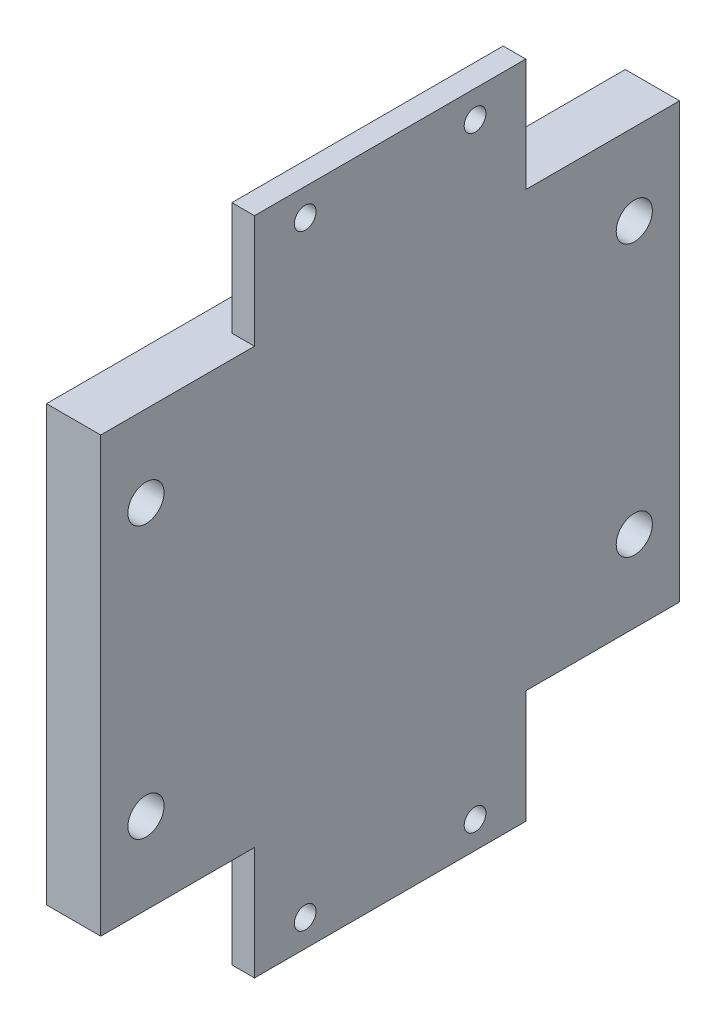
ISO-10303-21;
HEADER;
FILE_DESCRIPTION(('STEP AP214'),'2;1');
FILE_NAME('part.step','',(''),(''),'','','');
FILE_SCHEMA(('AUTOMOTIVE_DESIGN { 1 0 10303 214 1 1 1 1 }'));
ENDSEC;
DATA;
#1=APPLICATION_CONTEXT('core data for automotive mechanical design processes');
#2=APPLICATION_PROTOCOL_DEFINITION('international standard','automotive_design',2000,#1);
#3=PRODUCT_CONTEXT('',#1,'mechanical');
#4=PRODUCT('Part','Part','',(#3));
#5=PRODUCT_RELATED_PRODUCT_CATEGORY('part','',(#4));
#6=PRODUCT_DEFINITION_FORMATION('','',#4);
#7=PRODUCT_DEFINITION_CONTEXT('part definition',#1,'design');
#8=PRODUCT_DEFINITION('design','',#6,#7);
#9=PRODUCT_DEFINITION_SHAPE('','',#8);
#10=(LENGTH_UNIT() NAMED_UNIT(*) SI_UNIT(.MILLI.,.METRE.));
#11=(NAMED_UNIT(*) PLANE_ANGLE_UNIT() SI_UNIT($,.RADIAN.));
#12=(NAMED_UNIT(*) SI_UNIT($,.STERADIAN.) SOLID_ANGLE_UNIT());
#13=UNCERTAINTY_MEASURE_WITH_UNIT(LENGTH_MEASURE(1.E-05),#10,'distance_accuracy_value','');
#14=(GEOMETRIC_REPRESENTATION_CONTEXT(3) GLOBAL_UNCERTAINTY_ASSIGNED_CONTEXT((#13)) GLOBAL_UNIT_ASSIGNED_CONTEXT((#10,
#11,#12)) REPRESENTATION_CONTEXT('',''));
#15=CARTESIAN_POINT('',(0.,0.,0.));
#16=DIRECTION('',(0.,0.,1.));
#17=DIRECTION('',(1.,0.,0.));
#18=AXIS2_PLACEMENT_3D('',#15,#16,#17);
#19=CARTESIAN_POINT('',(3.,12.,16.));
#20=DIRECTION('',(0.,-1.,0.));
#21=DIRECTION('',(0.,0.,-1.));
#22=AXIS2_PLACEMENT_3D('',#19,#20,#21);
#23=PLANE('',#22);
#24=DIRECTION('',(0.,0.,1.));
#25=VECTOR('',#24,1.);
#26=CARTESIAN_POINT('',(3.,12.,16.));
#27=LINE('',#26,#25);
#28=CARTESIAN_POINT('',(3.,12.,7.5));
#29=VERTEX_POINT('',#28);
#30=CARTESIAN_POINT('',(3.,12.,16.));
#31=VERTEX_POINT('',#30);
#32=EDGE_CURVE('E244',#29,#31,#27,.T.);
#33=ORIENTED_EDGE('',*,*,#32,.F.);
#34=DIRECTION('',(-1.,0.,0.));
#35=VECTOR('',#34,1.);
#36=CARTESIAN_POINT('',(3.,12.,7.5));
#37=LINE('',#36,#35);
#38=CARTESIAN_POINT('',(1.74999447698335,12.,7.5));
#39=VERTEX_POINT('',#38);
#40=EDGE_CURVE('E160',#29,#39,#37,.T.);
#41=ORIENTED_EDGE('',*,*,#40,.T.);
#42=DIRECTION('',(0.,0.,-1.));
#43=VECTOR('',#42,1.);
#44=CARTESIAN_POINT('',(1.74999447698335,12.,16.));
#45=LINE('',#44,#43);
#46=CARTESIAN_POINT('',(1.74999447698335,12.,3.2));
#47=VERTEX_POINT('',#46);
#48=EDGE_CURVE('E49',#39,#47,#45,.T.);
#49=ORIENTED_EDGE('',*,*,#48,.T.);
#50=DIRECTION('',(-1.,0.,0.));
#51=VECTOR('',#50,1.);
#52=CARTESIAN_POINT('',(1.75,12.,3.2));
#53=LINE('',#52,#51);
#54=CARTESIAN_POINT('',(0.,12.,3.2));
#55=VERTEX_POINT('',#54);
#56=EDGE_CURVE('E229',#47,#55,#53,.T.);
#57=ORIENTED_EDGE('',*,*,#56,.T.);
#58=DIRECTION('',(0.,0.,1.));
#59=VECTOR('',#58,1.);
#60=CARTESIAN_POINT('',(0.,12.,16.));
#61=LINE('',#60,#59);
#62=CARTESIAN_POINT('',(0.,12.,16.));
#63=VERTEX_POINT('',#62);
#64=EDGE_CURVE('E257',#55,#63,#61,.T.);
#65=ORIENTED_EDGE('',*,*,#64,.T.);
#66=DIRECTION('',(-1.,0.,0.));
#67=VECTOR('',#66,1.);
#68=CARTESIAN_POINT('',(3.,12.,16.));
#69=LINE('',#68,#67);
#70=EDGE_CURVE('E271',#31,#63,#69,.T.);
#71=ORIENTED_EDGE('',*,*,#70,.F.);
#72=EDGE_LOOP('',(#33,#41,#49,#57,#65,#71));
#73=FACE_BOUND('',#72,.T.);
#74=ADVANCED_FACE('F38',(#73),#23,.F.);
#75=CARTESIAN_POINT('',(3.,-12.,16.));
#76=DIRECTION('',(0.,1.,0.));
#77=DIRECTION('',(0.,0.,1.));
#78=AXIS2_PLACEMENT_3D('',#75,#76,#77);
#79=PLANE('',#78);
#80=DIRECTION('',(1.,0.,0.));
#81=VECTOR('',#80,1.);
#82=CARTESIAN_POINT('',(3.,-12.,-7.5));
#83=LINE('',#82,#81);
#84=CARTESIAN_POINT('',(1.74999447698335,-12.,-7.5));
#85=VERTEX_POINT('',#84);
#86=CARTESIAN_POINT('',(3.,-12.,-7.5));
#87=VERTEX_POINT('',#86);
#88=EDGE_CURVE('E64',#85,#87,#83,.T.);
#89=ORIENTED_EDGE('',*,*,#88,.F.);
#90=DIRECTION('',(0.,0.,-1.));
#91=VECTOR('',#90,1.);
#92=CARTESIAN_POINT('',(1.74999447698335,-12.,7.5));
#93=LINE('',#92,#91);
#94=CARTESIAN_POINT('',(1.75,-12.,-3.2));
#95=VERTEX_POINT('',#94);
#96=EDGE_CURVE('E47',#95,#85,#93,.T.);
#97=ORIENTED_EDGE('',*,*,#96,.F.);
#98=DIRECTION('',(-1.,0.,0.));
#99=VECTOR('',#98,1.);
#100=CARTESIAN_POINT('',(1.75,-12.,-3.2));
#101=LINE('',#100,#99);
#102=CARTESIAN_POINT('',(0.,-12.,-3.2));
#103=VERTEX_POINT('',#102);
#104=EDGE_CURVE('E235',#95,#103,#101,.T.);
#105=ORIENTED_EDGE('',*,*,#104,.T.);
#106=DIRECTION('',(0.,0.,-1.));
#107=VECTOR('',#106,1.);
#108=CARTESIAN_POINT('',(0.,-12.,16.));
#109=LINE('',#108,#107);
#110=CARTESIAN_POINT('',(0.,-12.,-16.));
#111=VERTEX_POINT('',#110);
#112=EDGE_CURVE('E263',#103,#111,#109,.T.);
#113=ORIENTED_EDGE('',*,*,#112,.T.);
#114=DIRECTION('',(-1.,0.,0.));
#115=VECTOR('',#114,1.);
#116=CARTESIAN_POINT('',(3.,-12.,-16.));
#117=LINE('',#116,#115);
#118=CARTESIAN_POINT('',(3.,-12.,-16.));
#119=VERTEX_POINT('',#118);
#120=EDGE_CURVE('E254',#119,#111,#117,.T.);
#121=ORIENTED_EDGE('',*,*,#120,.F.);
#122=DIRECTION('',(0.,0.,-1.));
#123=VECTOR('',#122,1.);
#124=CARTESIAN_POINT('',(3.,-12.,16.));
#125=LINE('',#124,#123);
#126=EDGE_CURVE('E250',#87,#119,#125,.T.);
#127=ORIENTED_EDGE('',*,*,#126,.F.);
#128=EDGE_LOOP('',(#89,#97,#105,#113,#121,#127));
#129=FACE_BOUND('',#128,.T.);
#130=ADVANCED_FACE('F310',(#129),#79,.F.);
#131=CARTESIAN_POINT('',(1.74999447698335,-12.,7.5));
#132=VERTEX_POINT('',#131);
#133=CARTESIAN_POINT('',(1.75,-12.,3.2));
#134=VERTEX_POINT('',#133);
#135=EDGE_CURVE('E206',#132,#134,#93,.T.);
#136=ORIENTED_EDGE('',*,*,#135,.F.);
#137=DIRECTION('',(-1.,0.,0.));
#138=VECTOR('',#137,1.);
#139=CARTESIAN_POINT('',(3.,-12.,7.5));
#140=LINE('',#139,#138);
#141=CARTESIAN_POINT('',(3.,-12.,7.5));
#142=VERTEX_POINT('',#141);
#143=EDGE_CURVE('E190',#142,#132,#140,.T.);
#144=ORIENTED_EDGE('',*,*,#143,.F.);
#145=CARTESIAN_POINT('',(3.,-12.,16.));
#146=VERTEX_POINT('',#145);
#147=EDGE_CURVE('E251',#146,#142,#125,.T.);
#148=ORIENTED_EDGE('',*,*,#147,.F.);
#149=DIRECTION('',(-1.,0.,0.));
#150=VECTOR('',#149,1.);
#151=CARTESIAN_POINT('',(3.,-12.,16.));
#152=LINE('',#151,#150);
#153=CARTESIAN_POINT('',(0.,-12.,16.));
#154=VERTEX_POINT('',#153);
#155=EDGE_CURVE('E268',#146,#154,#152,.T.);
#156=ORIENTED_EDGE('',*,*,#155,.T.);
#157=CARTESIAN_POINT('',(0.,-12.,3.2));
#158=VERTEX_POINT('',#157);
#159=EDGE_CURVE('E245',#154,#158,#109,.T.);
#160=ORIENTED_EDGE('',*,*,#159,.T.);
#161=DIRECTION('',(-1.,0.,0.));
#162=VECTOR('',#161,1.);
#163=CARTESIAN_POINT('',(1.75,-12.,3.2));
#164=LINE('',#163,#162);
#165=EDGE_CURVE('E232',#134,#158,#164,.T.);
#166=ORIENTED_EDGE('',*,*,#165,.F.);
#167=EDGE_LOOP('',(#136,#144,#148,#156,#160,#166));
#168=FACE_BOUND('',#167,.T.);
#169=ADVANCED_FACE('F316',(#168),#79,.F.);
#170=CARTESIAN_POINT('',(0.,0.,0.));
#171=DIRECTION('',(-1.,0.,0.));
#172=DIRECTION('',(0.,0.,1.));
#173=AXIS2_PLACEMENT_3D('',#170,#171,#172);
#174=PLANE('',#173);
#175=CARTESIAN_POINT('',(0.,-7.5,13.5));
#176=DIRECTION('',(-1.,0.,0.));
#177=DIRECTION('',(0.,0.,1.));
#178=AXIS2_PLACEMENT_3D('',#175,#176,#177);
#179=CIRCLE('',#178,1.75);
#180=CARTESIAN_POINT('',(0.,-7.5,15.25));
#181=VERTEX_POINT('',#180);
#182=EDGE_CURVE('E396',#181,#181,#179,.T.);
#183=ORIENTED_EDGE('',*,*,#182,.F.);
#184=EDGE_LOOP('',(#183));
#185=FACE_BOUND('',#184,.T.);
#186=CARTESIAN_POINT('',(0.,7.5,13.5));
#187=DIRECTION('',(-1.,0.,0.));
#188=DIRECTION('',(0.,0.,1.));
#189=AXIS2_PLACEMENT_3D('',#186,#187,#188);
#190=CIRCLE('',#189,1.75);
#191=CARTESIAN_POINT('',(0.,7.5,15.25));
#192=VERTEX_POINT('',#191);
#193=EDGE_CURVE('E400',#192,#192,#190,.T.);
#194=ORIENTED_EDGE('',*,*,#193,.F.);
#195=EDGE_LOOP('',(#194));
#196=FACE_BOUND('',#195,.T.);
#197=DIRECTION('',(0.,1.,0.));
#198=VECTOR('',#197,1.);
#199=CARTESIAN_POINT('',(0.,12.,3.2));
#200=LINE('',#199,#198);
#201=EDGE_CURVE('E221',#158,#55,#200,.T.);
#202=ORIENTED_EDGE('',*,*,#201,.F.);
#203=ORIENTED_EDGE('',*,*,#159,.F.);
#204=DIRECTION('',(0.,-1.,0.));
#205=VECTOR('',#204,1.);
#206=CARTESIAN_POINT('',(0.,-12.,16.));
#207=LINE('',#206,#205);
#208=EDGE_CURVE('E261',#63,#154,#207,.T.);
#209=ORIENTED_EDGE('',*,*,#208,.F.);
#210=ORIENTED_EDGE('',*,*,#64,.F.);
#211=EDGE_LOOP('',(#202,#203,#209,#210));
#212=FACE_BOUND('',#211,.T.);
#213=ADVANCED_FACE('F327',(#185,#196,#212),#174,.T.);
#214=CARTESIAN_POINT('',(3.,-12.,-16.));
#215=DIRECTION('',(0.,0.,1.));
#216=DIRECTION('',(1.,0.,0.));
#217=AXIS2_PLACEMENT_3D('',#214,#215,#216);
#218=PLANE('',#217);
#219=DIRECTION('',(0.,1.,0.));
#220=VECTOR('',#219,1.);
#221=CARTESIAN_POINT('',(0.,-12.,-16.));
#222=LINE('',#221,#220);
#223=CARTESIAN_POINT('',(0.,12.,-16.));
#224=VERTEX_POINT('',#223);
#225=EDGE_CURVE('E234',#111,#224,#222,.T.);
#226=ORIENTED_EDGE('',*,*,#225,.T.);
#227=DIRECTION('',(-1.,0.,0.));
#228=VECTOR('',#227,1.);
#229=CARTESIAN_POINT('',(3.,12.,-16.));
#230=LINE('',#229,#228);
#231=CARTESIAN_POINT('',(3.,12.,-16.));
#232=VERTEX_POINT('',#231);
#233=EDGE_CURVE('E274',#232,#224,#230,.T.);
#234=ORIENTED_EDGE('',*,*,#233,.F.);
#235=DIRECTION('',(0.,1.,0.));
#236=VECTOR('',#235,1.);
#237=CARTESIAN_POINT('',(3.,-12.,-16.));
#238=LINE('',#237,#236);
#239=EDGE_CURVE('E242',#119,#232,#238,.T.);
#240=ORIENTED_EDGE('',*,*,#239,.F.);
#241=ORIENTED_EDGE('',*,*,#120,.T.);
#242=EDGE_LOOP('',(#226,#234,#240,#241));
#243=FACE_BOUND('',#242,.T.);
#244=ADVANCED_FACE('F40',(#243),#218,.F.);
#245=DIRECTION('',(-1.,0.,0.));
#246=VECTOR('',#245,1.);
#247=CARTESIAN_POINT('',(1.75,12.,-3.2));
#248=LINE('',#247,#246);
#249=CARTESIAN_POINT('',(1.74999447698335,12.,-3.2));
#250=VERTEX_POINT('',#249);
#251=CARTESIAN_POINT('',(0.,12.,-3.2));
#252=VERTEX_POINT('',#251);
#253=EDGE_CURVE('E238',#250,#252,#248,.T.);
#254=ORIENTED_EDGE('',*,*,#253,.F.);
#255=CARTESIAN_POINT('',(1.74999447698335,12.,-7.5));
#256=VERTEX_POINT('',#255);
#257=EDGE_CURVE('E11',#250,#256,#45,.T.);
#258=ORIENTED_EDGE('',*,*,#257,.T.);
#259=DIRECTION('',(1.,0.,0.));
#260=VECTOR('',#259,1.);
#261=CARTESIAN_POINT('',(3.,12.,-7.5));
#262=LINE('',#261,#260);
#263=CARTESIAN_POINT('',(3.,12.,-7.5));
#264=VERTEX_POINT('',#263);
#265=EDGE_CURVE('E179',#256,#264,#262,.T.);
#266=ORIENTED_EDGE('',*,*,#265,.T.);
#267=EDGE_CURVE('E246',#232,#264,#27,.T.);
#268=ORIENTED_EDGE('',*,*,#267,.F.);
#269=ORIENTED_EDGE('',*,*,#233,.T.);
#270=EDGE_CURVE('E258',#224,#252,#61,.T.);
#271=ORIENTED_EDGE('',*,*,#270,.T.);
#272=EDGE_LOOP('',(#254,#258,#266,#268,#269,#271));
#273=FACE_BOUND('',#272,.T.);
#274=ADVANCED_FACE('F312',(#273),#23,.F.);
#275=CARTESIAN_POINT('',(3.,-12.,16.));
#276=DIRECTION('',(0.,0.,-1.));
#277=DIRECTION('',(-1.,0.,0.));
#278=AXIS2_PLACEMENT_3D('',#275,#276,#277);
#279=PLANE('',#278);
#280=ORIENTED_EDGE('',*,*,#208,.T.);
#281=ORIENTED_EDGE('',*,*,#155,.F.);
#282=DIRECTION('',(0.,-1.,0.));
#283=VECTOR('',#282,1.);
#284=CARTESIAN_POINT('',(3.,-12.,16.));
#285=LINE('',#284,#283);
#286=EDGE_CURVE('E248',#31,#146,#285,.T.);
#287=ORIENTED_EDGE('',*,*,#286,.F.);
#288=ORIENTED_EDGE('',*,*,#70,.T.);
#289=EDGE_LOOP('',(#280,#281,#287,#288));
#290=FACE_BOUND('',#289,.T.);
#291=ADVANCED_FACE('F320',(#290),#279,.F.);
#292=CARTESIAN_POINT('',(3.,0.,0.));
#293=DIRECTION('',(-1.,0.,0.));
#294=DIRECTION('',(0.,0.,1.));
#295=AXIS2_PLACEMENT_3D('',#292,#293,#294);
#296=PLANE('',#295);
#297=CARTESIAN_POINT('',(3.,-7.5,-13.5));
#298=DIRECTION('',(-1.,0.,0.));
#299=DIRECTION('',(0.,0.,1.));
#300=AXIS2_PLACEMENT_3D('',#297,#298,#299);
#301=CIRCLE('',#300,1.);
#302=CARTESIAN_POINT('',(3.,-7.5,-12.5));
#303=VERTEX_POINT('',#302);
#304=EDGE_CURVE('E748',#303,#303,#301,.T.);
#305=ORIENTED_EDGE('',*,*,#304,.T.);
#306=EDGE_LOOP('',(#305));
#307=FACE_BOUND('',#306,.T.);
#308=CARTESIAN_POINT('',(3.,7.5,-13.5));
#309=DIRECTION('',(-1.,0.,0.));
#310=DIRECTION('',(0.,0.,1.));
#311=AXIS2_PLACEMENT_3D('',#308,#309,#310);
#312=CIRCLE('',#311,1.);
#313=CARTESIAN_POINT('',(3.,7.5,-12.5));
#314=VERTEX_POINT('',#313);
#315=EDGE_CURVE('E749',#314,#314,#312,.T.);
#316=ORIENTED_EDGE('',*,*,#315,.T.);
#317=EDGE_LOOP('',(#316));
#318=FACE_BOUND('',#317,.T.);
#319=CARTESIAN_POINT('',(3.,7.5,13.5));
#320=DIRECTION('',(-1.,0.,0.));
#321=DIRECTION('',(0.,0.,1.));
#322=AXIS2_PLACEMENT_3D('',#319,#320,#321);
#323=CIRCLE('',#322,1.);
#324=CARTESIAN_POINT('',(3.,7.5,14.5));
#325=VERTEX_POINT('',#324);
#326=EDGE_CURVE('E752',#325,#325,#323,.T.);
#327=ORIENTED_EDGE('',*,*,#326,.T.);
#328=EDGE_LOOP('',(#327));
#329=FACE_BOUND('',#328,.T.);
#330=CARTESIAN_POINT('',(3.,-7.5,13.5));
#331=DIRECTION('',(-1.,0.,0.));
#332=DIRECTION('',(0.,0.,1.));
#333=AXIS2_PLACEMENT_3D('',#330,#331,#332);
#334=CIRCLE('',#333,1.);
#335=CARTESIAN_POINT('',(3.,-7.5,14.5));
#336=VERTEX_POINT('',#335);
#337=EDGE_CURVE('E756',#336,#336,#334,.T.);
#338=ORIENTED_EDGE('',*,*,#337,.T.);
#339=EDGE_LOOP('',(#338));
#340=FACE_BOUND('',#339,.T.);
#341=CARTESIAN_POINT('',(3.,16.75,-4.69574275274954));
#342=DIRECTION('',(1.,0.,0.));
#343=DIRECTION('',(0.,0.,-1.));
#344=AXIS2_PLACEMENT_3D('',#341,#342,#343);
#345=CIRCLE('',#344,0.6);
#346=CARTESIAN_POINT('',(3.,16.75,-5.29574275274954));
#347=VERTEX_POINT('',#346);
#348=EDGE_CURVE('E418',#347,#347,#345,.T.);
#349=ORIENTED_EDGE('',*,*,#348,.F.);
#350=EDGE_LOOP('',(#349));
#351=FACE_BOUND('',#350,.T.);
#352=CARTESIAN_POINT('',(3.,16.75,4.69574275274958));
#353=DIRECTION('',(1.,0.,0.));
#354=DIRECTION('',(0.,0.,-1.));
#355=AXIS2_PLACEMENT_3D('',#352,#353,#354);
#356=CIRCLE('',#355,0.6);
#357=CARTESIAN_POINT('',(3.,16.75,4.09574275274958));
#358=VERTEX_POINT('',#357);
#359=EDGE_CURVE('E427',#358,#358,#356,.T.);
#360=ORIENTED_EDGE('',*,*,#359,.F.);
#361=EDGE_LOOP('',(#360));
#362=FACE_BOUND('',#361,.T.);
#363=CARTESIAN_POINT('',(3.,-16.75,4.69574275274957));
#364=DIRECTION('',(1.,0.,0.));
#365=DIRECTION('',(0.,0.,-1.));
#366=AXIS2_PLACEMENT_3D('',#363,#364,#365);
#367=CIRCLE('',#366,0.6);
#368=CARTESIAN_POINT('',(3.,-16.75,4.09574275274957));
#369=VERTEX_POINT('',#368);
#370=EDGE_CURVE('E424',#369,#369,#367,.T.);
#371=ORIENTED_EDGE('',*,*,#370,.F.);
#372=EDGE_LOOP('',(#371));
#373=FACE_BOUND('',#372,.T.);
#374=CARTESIAN_POINT('',(3.,-16.75,-4.69574275274955));
#375=DIRECTION('',(1.,0.,0.));
#376=DIRECTION('',(0.,0.,-1.));
#377=AXIS2_PLACEMENT_3D('',#374,#375,#376);
#378=CIRCLE('',#377,0.6);
#379=CARTESIAN_POINT('',(3.,-16.75,-5.29574275274955));
#380=VERTEX_POINT('',#379);
#381=EDGE_CURVE('E183',#380,#380,#378,.T.);
#382=ORIENTED_EDGE('',*,*,#381,.F.);
#383=EDGE_LOOP('',(#382));
#384=FACE_BOUND('',#383,.T.);
#385=ORIENTED_EDGE('',*,*,#239,.T.);
#386=ORIENTED_EDGE('',*,*,#267,.T.);
#387=DIRECTION('',(0.,-1.,0.));
#388=VECTOR('',#387,1.);
#389=CARTESIAN_POINT('',(3.,18.25,-7.5));
#390=LINE('',#389,#388);
#391=CARTESIAN_POINT('',(3.,18.25,-7.5));
#392=VERTEX_POINT('',#391);
#393=EDGE_CURVE('E56',#392,#264,#390,.T.);
#394=ORIENTED_EDGE('',*,*,#393,.F.);
#395=DIRECTION('',(0.,0.,1.));
#396=VECTOR('',#395,1.);
#397=CARTESIAN_POINT('',(3.,18.25,16.));
#398=LINE('',#397,#396);
#399=CARTESIAN_POINT('',(3.,18.25,7.5));
#400=VERTEX_POINT('',#399);
#401=EDGE_CURVE('E172',#392,#400,#398,.T.);
#402=ORIENTED_EDGE('',*,*,#401,.T.);
#403=DIRECTION('',(0.,-1.,0.));
#404=VECTOR('',#403,1.);
#405=CARTESIAN_POINT('',(3.,18.25,7.5));
#406=LINE('',#405,#404);
#407=EDGE_CURVE('E155',#400,#29,#406,.T.);
#408=ORIENTED_EDGE('',*,*,#407,.T.);
#409=ORIENTED_EDGE('',*,*,#32,.T.);
#410=ORIENTED_EDGE('',*,*,#286,.T.);
#411=ORIENTED_EDGE('',*,*,#147,.T.);
#412=DIRECTION('',(0.,1.,0.));
#413=VECTOR('',#412,1.);
#414=CARTESIAN_POINT('',(3.,-18.25,7.5));
#415=LINE('',#414,#413);
#416=CARTESIAN_POINT('',(3.,-18.25,7.5));
#417=VERTEX_POINT('',#416);
#418=EDGE_CURVE('E218',#417,#142,#415,.T.);
#419=ORIENTED_EDGE('',*,*,#418,.F.);
#420=DIRECTION('',(0.,0.,1.));
#421=VECTOR('',#420,1.);
#422=CARTESIAN_POINT('',(3.,-18.25,7.5));
#423=LINE('',#422,#421);
#424=CARTESIAN_POINT('',(3.,-18.25,-7.5));
#425=VERTEX_POINT('',#424);
#426=EDGE_CURVE('E194',#425,#417,#423,.T.);
#427=ORIENTED_EDGE('',*,*,#426,.F.);
#428=DIRECTION('',(0.,1.,0.));
#429=VECTOR('',#428,1.);
#430=CARTESIAN_POINT('',(3.,-18.25,-7.5));
#431=LINE('',#430,#429);
#432=EDGE_CURVE('E203',#425,#87,#431,.T.);
#433=ORIENTED_EDGE('',*,*,#432,.T.);
#434=ORIENTED_EDGE('',*,*,#126,.T.);
#435=EDGE_LOOP('',(#385,#386,#394,#402,#408,#409,#410,#411,#419,#427,#433,#434));
#436=FACE_BOUND('',#435,.T.);
#437=ADVANCED_FACE('F177',(#307,#318,#329,#340,#351,#362,#373,#384,#436),#296,.F.);
#438=CARTESIAN_POINT('',(0.,7.5,-13.5));
#439=DIRECTION('',(-1.,0.,0.));
#440=DIRECTION('',(0.,0.,1.));
#441=AXIS2_PLACEMENT_3D('',#438,#439,#440);
#442=CIRCLE('',#441,1.75);
#443=CARTESIAN_POINT('',(0.,7.5,-11.75));
#444=VERTEX_POINT('',#443);
#445=EDGE_CURVE('E778',#444,#444,#442,.T.);
#446=ORIENTED_EDGE('',*,*,#445,.F.);
#447=EDGE_LOOP('',(#446));
#448=FACE_BOUND('',#447,.T.);
#449=CARTESIAN_POINT('',(0.,-7.5,-13.5));
#450=DIRECTION('',(-1.,0.,0.));
#451=DIRECTION('',(0.,0.,1.));
#452=AXIS2_PLACEMENT_3D('',#449,#450,#451);
#453=CIRCLE('',#452,1.75);
#454=CARTESIAN_POINT('',(0.,-7.5,-11.75));
#455=VERTEX_POINT('',#454);
#456=EDGE_CURVE('E770',#455,#455,#453,.T.);
#457=ORIENTED_EDGE('',*,*,#456,.F.);
#458=EDGE_LOOP('',(#457));
#459=FACE_BOUND('',#458,.T.);
#460=DIRECTION('',(0.,-1.,0.));
#461=VECTOR('',#460,1.);
#462=CARTESIAN_POINT('',(0.,12.,-3.2));
#463=LINE('',#462,#461);
#464=EDGE_CURVE('E226',#252,#103,#463,.T.);
#465=ORIENTED_EDGE('',*,*,#464,.F.);
#466=ORIENTED_EDGE('',*,*,#270,.F.);
#467=ORIENTED_EDGE('',*,*,#225,.F.);
#468=ORIENTED_EDGE('',*,*,#112,.F.);
#469=EDGE_LOOP('',(#465,#466,#467,#468));
#470=FACE_BOUND('',#469,.T.);
#471=ADVANCED_FACE('F337',(#448,#459,#470),#174,.T.);
#472=CARTESIAN_POINT('',(1.75,12.,3.2));
#473=DIRECTION('',(0.,0.,1.));
#474=DIRECTION('',(0.,-1.,0.));
#475=AXIS2_PLACEMENT_3D('',#472,#473,#474);
#476=PLANE('',#475);
#477=ORIENTED_EDGE('',*,*,#201,.T.);
#478=ORIENTED_EDGE('',*,*,#56,.F.);
#479=DIRECTION('',(0.,1.,0.));
#480=VECTOR('',#479,1.);
#481=CARTESIAN_POINT('',(1.75,12.,3.2));
#482=LINE('',#481,#480);
#483=EDGE_CURVE('E222',#134,#47,#482,.T.);
#484=ORIENTED_EDGE('',*,*,#483,.F.);
#485=ORIENTED_EDGE('',*,*,#165,.T.);
#486=EDGE_LOOP('',(#477,#478,#484,#485));
#487=FACE_BOUND('',#486,.T.);
#488=ADVANCED_FACE('F373',(#487),#476,.F.);
#489=CARTESIAN_POINT('',(1.75,12.,-3.2));
#490=DIRECTION('',(0.,0.,-1.));
#491=DIRECTION('',(0.,1.,0.));
#492=AXIS2_PLACEMENT_3D('',#489,#490,#491);
#493=PLANE('',#492);
#494=ORIENTED_EDGE('',*,*,#464,.T.);
#495=ORIENTED_EDGE('',*,*,#104,.F.);
#496=DIRECTION('',(0.,-1.,0.));
#497=VECTOR('',#496,1.);
#498=CARTESIAN_POINT('',(1.75,12.,-3.2));
#499=LINE('',#498,#497);
#500=EDGE_CURVE('E225',#250,#95,#499,.T.);
#501=ORIENTED_EDGE('',*,*,#500,.F.);
#502=ORIENTED_EDGE('',*,*,#253,.T.);
#503=EDGE_LOOP('',(#494,#495,#501,#502));
#504=FACE_BOUND('',#503,.T.);
#505=ADVANCED_FACE('F333',(#504),#493,.F.);
#506=CARTESIAN_POINT('',(1.75,0.,0.));
#507=DIRECTION('',(1.,0.,0.));
#508=DIRECTION('',(0.,0.,-1.));
#509=AXIS2_PLACEMENT_3D('',#506,#507,#508);
#510=PLANE('',#509);
#511=CARTESIAN_POINT('',(1.75,16.75,-4.69574275274954));
#512=DIRECTION('',(1.,0.,0.));
#513=DIRECTION('',(0.,0.,-1.));
#514=AXIS2_PLACEMENT_3D('',#511,#512,#513);
#515=CIRCLE('',#514,0.6);
#516=CARTESIAN_POINT('',(1.75,16.75,-5.29574275274954));
#517=VERTEX_POINT('',#516);
#518=EDGE_CURVE('E42',#517,#517,#515,.T.);
#519=ORIENTED_EDGE('',*,*,#518,.T.);
#520=EDGE_LOOP('',(#519));
#521=FACE_BOUND('',#520,.T.);
#522=CARTESIAN_POINT('',(1.75,16.75,4.69574275274958));
#523=DIRECTION('',(1.,0.,0.));
#524=DIRECTION('',(0.,0.,-1.));
#525=AXIS2_PLACEMENT_3D('',#522,#523,#524);
#526=CIRCLE('',#525,0.6);
#527=CARTESIAN_POINT('',(1.75,16.75,4.09574275274958));
#528=VERTEX_POINT('',#527);
#529=EDGE_CURVE('E282',#528,#528,#526,.T.);
#530=ORIENTED_EDGE('',*,*,#529,.T.);
#531=EDGE_LOOP('',(#530));
#532=FACE_BOUND('',#531,.T.);
#533=CARTESIAN_POINT('',(1.75,-16.75,4.69574275274957));
#534=DIRECTION('',(1.,0.,0.));
#535=DIRECTION('',(0.,0.,-1.));
#536=AXIS2_PLACEMENT_3D('',#533,#534,#535);
#537=CIRCLE('',#536,0.6);
#538=CARTESIAN_POINT('',(1.75,-16.75,4.09574275274957));
#539=VERTEX_POINT('',#538);
#540=EDGE_CURVE('E280',#539,#539,#537,.T.);
#541=ORIENTED_EDGE('',*,*,#540,.T.);
#542=EDGE_LOOP('',(#541));
#543=FACE_BOUND('',#542,.T.);
#544=CARTESIAN_POINT('',(1.75,-16.75,-4.69574275274955));
#545=DIRECTION('',(1.,0.,0.));
#546=DIRECTION('',(0.,0.,-1.));
#547=AXIS2_PLACEMENT_3D('',#544,#545,#546);
#548=CIRCLE('',#547,0.6);
#549=CARTESIAN_POINT('',(1.75,-16.75,-5.29574275274955));
#550=VERTEX_POINT('',#549);
#551=EDGE_CURVE('E277',#550,#550,#548,.T.);
#552=ORIENTED_EDGE('',*,*,#551,.T.);
#553=EDGE_LOOP('',(#552));
#554=FACE_BOUND('',#553,.T.);
#555=ORIENTED_EDGE('',*,*,#483,.T.);
#556=ORIENTED_EDGE('',*,*,#48,.F.);
#557=DIRECTION('',(0.,-1.,0.));
#558=VECTOR('',#557,1.);
#559=CARTESIAN_POINT('',(1.74999447698335,18.25,7.5));
#560=LINE('',#559,#558);
#561=CARTESIAN_POINT('',(1.74999447698335,18.25,7.5));
#562=VERTEX_POINT('',#561);
#563=EDGE_CURVE('E164',#562,#39,#560,.T.);
#564=ORIENTED_EDGE('',*,*,#563,.F.);
#565=DIRECTION('',(0.,0.,-1.));
#566=VECTOR('',#565,1.);
#567=CARTESIAN_POINT('',(1.74999447698335,18.25,16.));
#568=LINE('',#567,#566);
#569=CARTESIAN_POINT('',(1.74999447698335,18.25,-7.5));
#570=VERTEX_POINT('',#569);
#571=EDGE_CURVE('E174',#562,#570,#568,.T.);
#572=ORIENTED_EDGE('',*,*,#571,.T.);
#573=DIRECTION('',(0.,-1.,0.));
#574=VECTOR('',#573,1.);
#575=CARTESIAN_POINT('',(1.74999447698335,18.25,-7.5));
#576=LINE('',#575,#574);
#577=EDGE_CURVE('E191',#570,#256,#576,.T.);
#578=ORIENTED_EDGE('',*,*,#577,.T.);
#579=ORIENTED_EDGE('',*,*,#257,.F.);
#580=ORIENTED_EDGE('',*,*,#500,.T.);
#581=ORIENTED_EDGE('',*,*,#96,.T.);
#582=DIRECTION('',(0.,1.,0.));
#583=VECTOR('',#582,1.);
#584=CARTESIAN_POINT('',(1.74999447698335,-18.25,-7.5));
#585=LINE('',#584,#583);
#586=CARTESIAN_POINT('',(1.74999447698335,-18.25,-7.5));
#587=VERTEX_POINT('',#586);
#588=EDGE_CURVE('E212',#587,#85,#585,.T.);
#589=ORIENTED_EDGE('',*,*,#588,.F.);
#590=DIRECTION('',(0.,0.,-1.));
#591=VECTOR('',#590,1.);
#592=CARTESIAN_POINT('',(1.74999447698335,-18.25,7.5));
#593=LINE('',#592,#591);
#594=CARTESIAN_POINT('',(1.74999447698335,-18.25,7.5));
#595=VERTEX_POINT('',#594);
#596=EDGE_CURVE('E199',#595,#587,#593,.T.);
#597=ORIENTED_EDGE('',*,*,#596,.F.);
#598=DIRECTION('',(0.,1.,0.));
#599=VECTOR('',#598,1.);
#600=CARTESIAN_POINT('',(1.74999447698335,-18.25,7.5));
#601=LINE('',#600,#599);
#602=EDGE_CURVE('E215',#595,#132,#601,.T.);
#603=ORIENTED_EDGE('',*,*,#602,.T.);
#604=ORIENTED_EDGE('',*,*,#135,.T.);
#605=EDGE_LOOP('',(#555,#556,#564,#572,#578,#579,#580,#581,#589,#597,#603,#604));
#606=FACE_BOUND('',#605,.T.);
#607=ADVANCED_FACE('F289',(#521,#532,#543,#554,#606),#510,.F.);
#608=CARTESIAN_POINT('',(3.,-18.25,7.5));
#609=DIRECTION('',(0.,0.,-1.));
#610=DIRECTION('',(-1.,0.,0.));
#611=AXIS2_PLACEMENT_3D('',#608,#609,#610);
#612=PLANE('',#611);
#613=ORIENTED_EDGE('',*,*,#143,.T.);
#614=ORIENTED_EDGE('',*,*,#602,.F.);
#615=DIRECTION('',(-1.,0.,0.));
#616=VECTOR('',#615,1.);
#617=CARTESIAN_POINT('',(3.,-18.25,7.5));
#618=LINE('',#617,#616);
#619=EDGE_CURVE('E197',#417,#595,#618,.T.);
#620=ORIENTED_EDGE('',*,*,#619,.F.);
#621=ORIENTED_EDGE('',*,*,#418,.T.);
#622=EDGE_LOOP('',(#613,#614,#620,#621));
#623=FACE_BOUND('',#622,.T.);
#624=ADVANCED_FACE('F365',(#623),#612,.F.);
#625=CARTESIAN_POINT('',(3.,-18.25,-7.5));
#626=DIRECTION('',(0.,0.,1.));
#627=DIRECTION('',(1.,0.,0.));
#628=AXIS2_PLACEMENT_3D('',#625,#626,#627);
#629=PLANE('',#628);
#630=ORIENTED_EDGE('',*,*,#88,.T.);
#631=ORIENTED_EDGE('',*,*,#432,.F.);
#632=DIRECTION('',(1.,0.,0.));
#633=VECTOR('',#632,1.);
#634=CARTESIAN_POINT('',(3.,-18.25,-7.5));
#635=LINE('',#634,#633);
#636=EDGE_CURVE('E201',#587,#425,#635,.T.);
#637=ORIENTED_EDGE('',*,*,#636,.F.);
#638=ORIENTED_EDGE('',*,*,#588,.T.);
#639=EDGE_LOOP('',(#630,#631,#637,#638));
#640=FACE_BOUND('',#639,.T.);
#641=ADVANCED_FACE('F345',(#640),#629,.F.);
#642=CARTESIAN_POINT('',(0.,-18.25,0.));
#643=DIRECTION('',(0.,1.,0.));
#644=DIRECTION('',(0.,0.,1.));
#645=AXIS2_PLACEMENT_3D('',#642,#643,#644);
#646=PLANE('',#645);
#647=ORIENTED_EDGE('',*,*,#426,.T.);
#648=ORIENTED_EDGE('',*,*,#619,.T.);
#649=ORIENTED_EDGE('',*,*,#596,.T.);
#650=ORIENTED_EDGE('',*,*,#636,.T.);
#651=EDGE_LOOP('',(#647,#648,#649,#650));
#652=FACE_BOUND('',#651,.T.);
#653=ADVANCED_FACE('F352',(#652),#646,.F.);
#654=CARTESIAN_POINT('',(3.,18.25,-7.5));
#655=DIRECTION('',(0.,0.,-1.));
#656=DIRECTION('',(-1.,0.,0.));
#657=AXIS2_PLACEMENT_3D('',#654,#655,#656);
#658=PLANE('',#657);
#659=ORIENTED_EDGE('',*,*,#265,.F.);
#660=ORIENTED_EDGE('',*,*,#577,.F.);
#661=DIRECTION('',(1.,0.,0.));
#662=VECTOR('',#661,1.);
#663=CARTESIAN_POINT('',(3.,18.25,-7.5));
#664=LINE('',#663,#662);
#665=EDGE_CURVE('E165',#570,#392,#664,.T.);
#666=ORIENTED_EDGE('',*,*,#665,.T.);
#667=ORIENTED_EDGE('',*,*,#393,.T.);
#668=EDGE_LOOP('',(#659,#660,#666,#667));
#669=FACE_BOUND('',#668,.T.);
#670=ADVANCED_FACE('F350',(#669),#658,.T.);
#671=CARTESIAN_POINT('',(3.,18.25,7.5));
#672=DIRECTION('',(0.,0.,1.));
#673=DIRECTION('',(1.,0.,0.));
#674=AXIS2_PLACEMENT_3D('',#671,#672,#673);
#675=PLANE('',#674);
#676=ORIENTED_EDGE('',*,*,#40,.F.);
#677=ORIENTED_EDGE('',*,*,#407,.F.);
#678=DIRECTION('',(-1.,0.,0.));
#679=VECTOR('',#678,1.);
#680=CARTESIAN_POINT('',(3.,18.25,7.5));
#681=LINE('',#680,#679);
#682=EDGE_CURVE('E158',#400,#562,#681,.T.);
#683=ORIENTED_EDGE('',*,*,#682,.T.);
#684=ORIENTED_EDGE('',*,*,#563,.T.);
#685=EDGE_LOOP('',(#676,#677,#683,#684));
#686=FACE_BOUND('',#685,.T.);
#687=ADVANCED_FACE('F157',(#686),#675,.T.);
#688=CARTESIAN_POINT('',(0.,18.25,0.));
#689=DIRECTION('',(0.,-1.,0.));
#690=DIRECTION('',(0.,0.,-1.));
#691=AXIS2_PLACEMENT_3D('',#688,#689,#690);
#692=PLANE('',#691);
#693=ORIENTED_EDGE('',*,*,#401,.F.);
#694=ORIENTED_EDGE('',*,*,#665,.F.);
#695=ORIENTED_EDGE('',*,*,#571,.F.);
#696=ORIENTED_EDGE('',*,*,#682,.F.);
#697=EDGE_LOOP('',(#693,#694,#695,#696));
#698=FACE_BOUND('',#697,.T.);
#699=ADVANCED_FACE('F170',(#698),#692,.F.);
#700=CARTESIAN_POINT('',(0.,-16.75,-4.69574275274955));
#701=DIRECTION('',(1.,0.,0.));
#702=DIRECTION('',(0.,0.,-1.));
#703=AXIS2_PLACEMENT_3D('',#700,#701,#702);
#704=CYLINDRICAL_SURFACE('',#703,0.6);
#705=ORIENTED_EDGE('',*,*,#381,.T.);
#706=EDGE_LOOP('',(#705));
#707=FACE_BOUND('',#706,.T.);
#708=ORIENTED_EDGE('',*,*,#551,.F.);
#709=EDGE_LOOP('',(#708));
#710=FACE_BOUND('',#709,.T.);
#711=ADVANCED_FACE('F439',(#707,#710),#704,.F.);
#712=CARTESIAN_POINT('',(0.,-16.75,4.69574275274957));
#713=DIRECTION('',(1.,0.,0.));
#714=DIRECTION('',(0.,0.,-1.));
#715=AXIS2_PLACEMENT_3D('',#712,#713,#714);
#716=CYLINDRICAL_SURFACE('',#715,0.6);
#717=ORIENTED_EDGE('',*,*,#370,.T.);
#718=EDGE_LOOP('',(#717));
#719=FACE_BOUND('',#718,.T.);
#720=ORIENTED_EDGE('',*,*,#540,.F.);
#721=EDGE_LOOP('',(#720));
#722=FACE_BOUND('',#721,.T.);
#723=ADVANCED_FACE('F304',(#719,#722),#716,.F.);
#724=CARTESIAN_POINT('',(0.,16.75,4.69574275274958));
#725=DIRECTION('',(1.,0.,0.));
#726=DIRECTION('',(0.,0.,-1.));
#727=AXIS2_PLACEMENT_3D('',#724,#725,#726);
#728=CYLINDRICAL_SURFACE('',#727,0.6);
#729=ORIENTED_EDGE('',*,*,#359,.T.);
#730=EDGE_LOOP('',(#729));
#731=FACE_BOUND('',#730,.T.);
#732=ORIENTED_EDGE('',*,*,#529,.F.);
#733=EDGE_LOOP('',(#732));
#734=FACE_BOUND('',#733,.T.);
#735=ADVANCED_FACE('F294',(#731,#734),#728,.F.);
#736=CARTESIAN_POINT('',(0.,16.75,-4.69574275274954));
#737=DIRECTION('',(1.,0.,0.));
#738=DIRECTION('',(0.,0.,-1.));
#739=AXIS2_PLACEMENT_3D('',#736,#737,#738);
#740=CYLINDRICAL_SURFACE('',#739,0.6);
#741=ORIENTED_EDGE('',*,*,#348,.T.);
#742=EDGE_LOOP('',(#741));
#743=FACE_BOUND('',#742,.T.);
#744=ORIENTED_EDGE('',*,*,#518,.F.);
#745=EDGE_LOOP('',(#744));
#746=FACE_BOUND('',#745,.T.);
#747=ADVANCED_FACE('F291',(#743,#746),#740,.F.);
#748=CARTESIAN_POINT('',(1.5,-7.5,-13.5));
#749=DIRECTION('',(-1.,0.,0.));
#750=DIRECTION('',(0.,0.,1.));
#751=AXIS2_PLACEMENT_3D('',#748,#749,#750);
#752=CYLINDRICAL_SURFACE('',#751,1.75);
#753=CARTESIAN_POINT('',(1.5,-7.5,-13.5));
#754=DIRECTION('',(-1.,0.,0.));
#755=DIRECTION('',(0.,0.,1.));
#756=AXIS2_PLACEMENT_3D('',#753,#754,#755);
#757=CIRCLE('',#756,1.75);
#758=CARTESIAN_POINT('',(1.5,-7.5,-11.75));
#759=VERTEX_POINT('',#758);
#760=EDGE_CURVE('E769',#759,#759,#757,.T.);
#761=ORIENTED_EDGE('',*,*,#760,.F.);
#762=EDGE_LOOP('',(#761));
#763=FACE_BOUND('',#762,.T.);
#764=ORIENTED_EDGE('',*,*,#456,.T.);
#765=EDGE_LOOP('',(#764));
#766=FACE_BOUND('',#765,.T.);
#767=ADVANCED_FACE('F293',(#763,#766),#752,.F.);
#768=CARTESIAN_POINT('',(1.5,-7.5,-13.5));
#769=DIRECTION('',(-1.,0.,0.));
#770=DIRECTION('',(0.,0.,1.));
#771=AXIS2_PLACEMENT_3D('',#768,#769,#770);
#772=PLANE('',#771);
#773=CARTESIAN_POINT('',(1.5,-7.5,-13.5));
#774=DIRECTION('',(-1.,0.,0.));
#775=DIRECTION('',(0.,0.,1.));
#776=AXIS2_PLACEMENT_3D('',#773,#774,#775);
#777=CIRCLE('',#776,1.);
#778=CARTESIAN_POINT('',(1.5,-7.5,-12.5));
#779=VERTEX_POINT('',#778);
#780=EDGE_CURVE('E745',#779,#779,#777,.T.);
#781=ORIENTED_EDGE('',*,*,#780,.F.);
#782=EDGE_LOOP('',(#781));
#783=FACE_BOUND('',#782,.T.);
#784=ORIENTED_EDGE('',*,*,#760,.T.);
#785=EDGE_LOOP('',(#784));
#786=FACE_BOUND('',#785,.T.);
#787=ADVANCED_FACE('F301',(#783,#786),#772,.T.);
#788=CARTESIAN_POINT('',(1.5,7.5,-13.5));
#789=DIRECTION('',(-1.,0.,0.));
#790=DIRECTION('',(0.,0.,1.));
#791=AXIS2_PLACEMENT_3D('',#788,#789,#790);
#792=CYLINDRICAL_SURFACE('',#791,1.75);
#793=CARTESIAN_POINT('',(1.5,7.5,-13.5));
#794=DIRECTION('',(-1.,0.,0.));
#795=DIRECTION('',(0.,0.,1.));
#796=AXIS2_PLACEMENT_3D('',#793,#794,#795);
#797=CIRCLE('',#796,1.75);
#798=CARTESIAN_POINT('',(1.5,7.5,-11.75));
#799=VERTEX_POINT('',#798);
#800=EDGE_CURVE('E773',#799,#799,#797,.T.);
#801=ORIENTED_EDGE('',*,*,#800,.F.);
#802=EDGE_LOOP('',(#801));
#803=FACE_BOUND('',#802,.T.);
#804=ORIENTED_EDGE('',*,*,#445,.T.);
#805=EDGE_LOOP('',(#804));
#806=FACE_BOUND('',#805,.T.);
#807=ADVANCED_FACE('F617',(#803,#806),#792,.F.);
#808=CARTESIAN_POINT('',(1.5,7.5,-13.5));
#809=DIRECTION('',(-1.,0.,0.));
#810=DIRECTION('',(0.,0.,1.));
#811=AXIS2_PLACEMENT_3D('',#808,#809,#810);
#812=PLANE('',#811);
#813=CARTESIAN_POINT('',(1.5,7.5,-13.5));
#814=DIRECTION('',(-1.,0.,0.));
#815=DIRECTION('',(0.,0.,1.));
#816=AXIS2_PLACEMENT_3D('',#813,#814,#815);
#817=CIRCLE('',#816,1.);
#818=CARTESIAN_POINT('',(1.5,7.5,-12.5));
#819=VERTEX_POINT('',#818);
#820=EDGE_CURVE('E765',#819,#819,#817,.T.);
#821=ORIENTED_EDGE('',*,*,#820,.F.);
#822=EDGE_LOOP('',(#821));
#823=FACE_BOUND('',#822,.T.);
#824=ORIENTED_EDGE('',*,*,#800,.T.);
#825=EDGE_LOOP('',(#824));
#826=FACE_BOUND('',#825,.T.);
#827=ADVANCED_FACE('F628',(#823,#826),#812,.T.);
#828=CARTESIAN_POINT('',(1.5,7.5,13.5));
#829=DIRECTION('',(-1.,0.,0.));
#830=DIRECTION('',(0.,0.,1.));
#831=AXIS2_PLACEMENT_3D('',#828,#829,#830);
#832=CYLINDRICAL_SURFACE('',#831,1.75);
#833=CARTESIAN_POINT('',(1.5,7.5,13.5));
#834=DIRECTION('',(-1.,0.,0.));
#835=DIRECTION('',(0.,0.,1.));
#836=AXIS2_PLACEMENT_3D('',#833,#834,#835);
#837=CIRCLE('',#836,1.75);
#838=CARTESIAN_POINT('',(1.5,7.5,15.25));
#839=VERTEX_POINT('',#838);
#840=EDGE_CURVE('E415',#839,#839,#837,.T.);
#841=ORIENTED_EDGE('',*,*,#840,.F.);
#842=EDGE_LOOP('',(#841));
#843=FACE_BOUND('',#842,.T.);
#844=ORIENTED_EDGE('',*,*,#193,.T.);
#845=EDGE_LOOP('',(#844));
#846=FACE_BOUND('',#845,.T.);
#847=ADVANCED_FACE('F639',(#843,#846),#832,.F.);
#848=CARTESIAN_POINT('',(1.5,7.5,13.5));
#849=DIRECTION('',(-1.,0.,0.));
#850=DIRECTION('',(0.,0.,1.));
#851=AXIS2_PLACEMENT_3D('',#848,#849,#850);
#852=PLANE('',#851);
#853=CARTESIAN_POINT('',(1.5,7.5,13.5));
#854=DIRECTION('',(-1.,0.,0.));
#855=DIRECTION('',(0.,0.,1.));
#856=AXIS2_PLACEMENT_3D('',#853,#854,#855);
#857=CIRCLE('',#856,1.);
#858=CARTESIAN_POINT('',(1.5,7.5,14.5));
#859=VERTEX_POINT('',#858);
#860=EDGE_CURVE('E762',#859,#859,#857,.T.);
#861=ORIENTED_EDGE('',*,*,#860,.F.);
#862=EDGE_LOOP('',(#861));
#863=FACE_BOUND('',#862,.T.);
#864=ORIENTED_EDGE('',*,*,#840,.T.);
#865=EDGE_LOOP('',(#864));
#866=FACE_BOUND('',#865,.T.);
#867=ADVANCED_FACE('F650',(#863,#866),#852,.T.);
#868=CARTESIAN_POINT('',(1.5,-7.5,13.5));
#869=DIRECTION('',(-1.,0.,0.));
#870=DIRECTION('',(0.,0.,1.));
#871=AXIS2_PLACEMENT_3D('',#868,#869,#870);
#872=CYLINDRICAL_SURFACE('',#871,1.75);
#873=CARTESIAN_POINT('',(1.5,-7.5,13.5));
#874=DIRECTION('',(-1.,0.,0.));
#875=DIRECTION('',(0.,0.,1.));
#876=AXIS2_PLACEMENT_3D('',#873,#874,#875);
#877=CIRCLE('',#876,1.75);
#878=CARTESIAN_POINT('',(1.5,-7.5,15.25));
#879=VERTEX_POINT('',#878);
#880=EDGE_CURVE('E420',#879,#879,#877,.T.);
#881=ORIENTED_EDGE('',*,*,#880,.F.);
#882=EDGE_LOOP('',(#881));
#883=FACE_BOUND('',#882,.T.);
#884=ORIENTED_EDGE('',*,*,#182,.T.);
#885=EDGE_LOOP('',(#884));
#886=FACE_BOUND('',#885,.T.);
#887=ADVANCED_FACE('F661',(#883,#886),#872,.F.);
#888=CARTESIAN_POINT('',(1.5,-7.5,13.5));
#889=DIRECTION('',(-1.,0.,0.));
#890=DIRECTION('',(0.,0.,1.));
#891=AXIS2_PLACEMENT_3D('',#888,#889,#890);
#892=PLANE('',#891);
#893=CARTESIAN_POINT('',(1.5,-7.5,13.5));
#894=DIRECTION('',(-1.,0.,0.));
#895=DIRECTION('',(0.,0.,1.));
#896=AXIS2_PLACEMENT_3D('',#893,#894,#895);
#897=CIRCLE('',#896,1.);
#898=CARTESIAN_POINT('',(1.5,-7.5,14.5));
#899=VERTEX_POINT('',#898);
#900=EDGE_CURVE('E759',#899,#899,#897,.T.);
#901=ORIENTED_EDGE('',*,*,#900,.F.);
#902=EDGE_LOOP('',(#901));
#903=FACE_BOUND('',#902,.T.);
#904=ORIENTED_EDGE('',*,*,#880,.T.);
#905=EDGE_LOOP('',(#904));
#906=FACE_BOUND('',#905,.T.);
#907=ADVANCED_FACE('F672',(#903,#906),#892,.T.);
#908=CARTESIAN_POINT('',(3.,-7.5,13.5));
#909=DIRECTION('',(-1.,0.,0.));
#910=DIRECTION('',(0.,0.,1.));
#911=AXIS2_PLACEMENT_3D('',#908,#909,#910);
#912=CYLINDRICAL_SURFACE('',#911,1.);
#913=ORIENTED_EDGE('',*,*,#900,.T.);
#914=EDGE_LOOP('',(#913));
#915=FACE_BOUND('',#914,.T.);
#916=ORIENTED_EDGE('',*,*,#337,.F.);
#917=EDGE_LOOP('',(#916));
#918=FACE_BOUND('',#917,.T.);
#919=ADVANCED_FACE('F683',(#915,#918),#912,.F.);
#920=CARTESIAN_POINT('',(3.,7.5,13.5));
#921=DIRECTION('',(-1.,0.,0.));
#922=DIRECTION('',(0.,0.,1.));
#923=AXIS2_PLACEMENT_3D('',#920,#921,#922);
#924=CYLINDRICAL_SURFACE('',#923,1.);
#925=ORIENTED_EDGE('',*,*,#860,.T.);
#926=EDGE_LOOP('',(#925));
#927=FACE_BOUND('',#926,.T.);
#928=ORIENTED_EDGE('',*,*,#326,.F.);
#929=EDGE_LOOP('',(#928));
#930=FACE_BOUND('',#929,.T.);
#931=ADVANCED_FACE('F694',(#927,#930),#924,.F.);
#932=CARTESIAN_POINT('',(3.,7.5,-13.5));
#933=DIRECTION('',(-1.,0.,0.));
#934=DIRECTION('',(0.,0.,1.));
#935=AXIS2_PLACEMENT_3D('',#932,#933,#934);
#936=CYLINDRICAL_SURFACE('',#935,1.);
#937=ORIENTED_EDGE('',*,*,#820,.T.);
#938=EDGE_LOOP('',(#937));
#939=FACE_BOUND('',#938,.T.);
#940=ORIENTED_EDGE('',*,*,#315,.F.);
#941=EDGE_LOOP('',(#940));
#942=FACE_BOUND('',#941,.T.);
#943=ADVANCED_FACE('F705',(#939,#942),#936,.F.);
#944=CARTESIAN_POINT('',(3.,-7.5,-13.5));
#945=DIRECTION('',(-1.,0.,0.));
#946=DIRECTION('',(0.,0.,1.));
#947=AXIS2_PLACEMENT_3D('',#944,#945,#946);
#948=CYLINDRICAL_SURFACE('',#947,1.);
#949=ORIENTED_EDGE('',*,*,#780,.T.);
#950=EDGE_LOOP('',(#949));
#951=FACE_BOUND('',#950,.T.);
#952=ORIENTED_EDGE('',*,*,#304,.F.);
#953=EDGE_LOOP('',(#952));
#954=FACE_BOUND('',#953,.T.);
#955=ADVANCED_FACE('F716',(#951,#954),#948,.F.);
#956=CLOSED_SHELL('',(#74,#130,#169,#213,#244,#274,#291,#437,#471,#488,#505,#607,#624,#641,#653,
#670,#687,#699,#711,#723,#735,#747,#767,#787,#807,#827,#847,#867,#887,#907,#919,#931,#943,#955));
#957=MANIFOLD_SOLID_BREP('B2',#956);
#958=ADVANCED_BREP_SHAPE_REPRESENTATION('',(#18,#957),#14);
#959=SHAPE_DEFINITION_REPRESENTATION(#9,#958);
ENDSEC;
END-ISO-10303-21;
